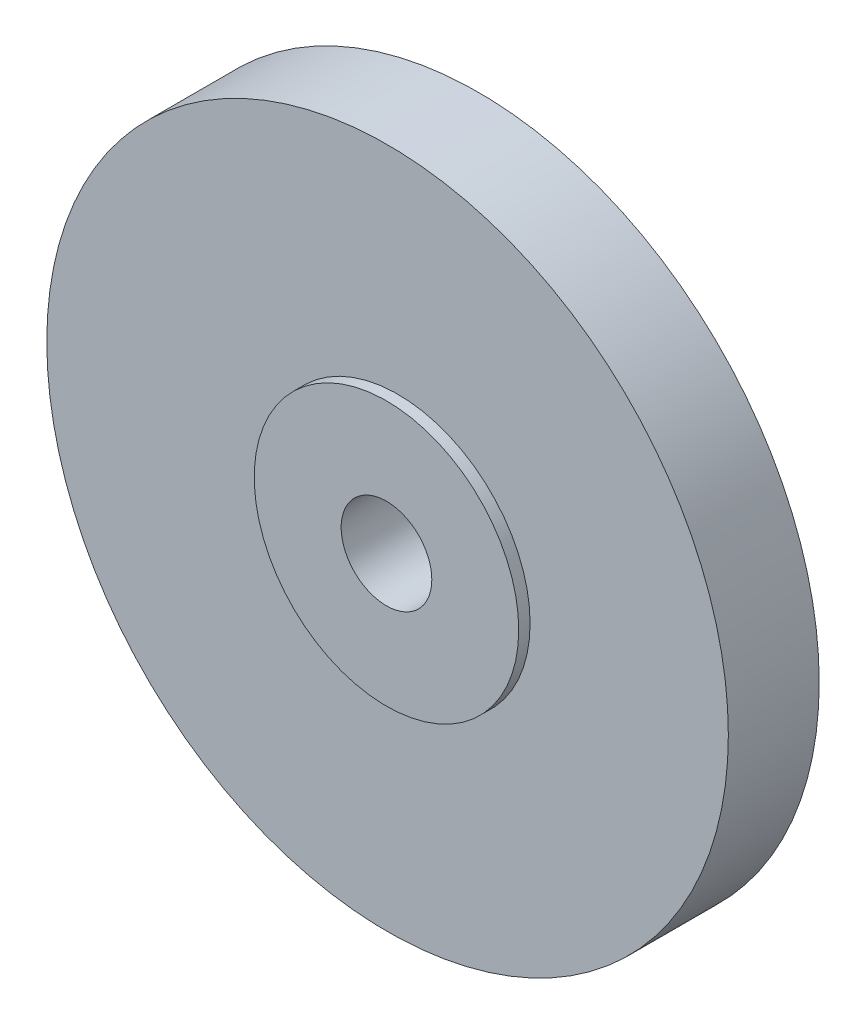
ISO-10303-21;
HEADER;
FILE_DESCRIPTION(('STEP AP214'),'2;1');
FILE_NAME('part.step','',(''),(''),'','','');
FILE_SCHEMA(('AUTOMOTIVE_DESIGN { 1 0 10303 214 1 1 1 1 }'));
ENDSEC;
DATA;
#1=APPLICATION_CONTEXT('core data for automotive mechanical design processes');
#2=APPLICATION_PROTOCOL_DEFINITION('international standard','automotive_design',2000,#1);
#3=PRODUCT_CONTEXT('',#1,'mechanical');
#4=PRODUCT('Part','Part','',(#3));
#5=PRODUCT_RELATED_PRODUCT_CATEGORY('part','',(#4));
#6=PRODUCT_DEFINITION_FORMATION('','',#4);
#7=PRODUCT_DEFINITION_CONTEXT('part definition',#1,'design');
#8=PRODUCT_DEFINITION('design','',#6,#7);
#9=PRODUCT_DEFINITION_SHAPE('','',#8);
#10=(LENGTH_UNIT() NAMED_UNIT(*) SI_UNIT(.MILLI.,.METRE.));
#11=(NAMED_UNIT(*) PLANE_ANGLE_UNIT() SI_UNIT($,.RADIAN.));
#12=(NAMED_UNIT(*) SI_UNIT($,.STERADIAN.) SOLID_ANGLE_UNIT());
#13=UNCERTAINTY_MEASURE_WITH_UNIT(LENGTH_MEASURE(1.E-05),#10,'distance_accuracy_value','');
#14=(GEOMETRIC_REPRESENTATION_CONTEXT(3) GLOBAL_UNCERTAINTY_ASSIGNED_CONTEXT((#13)) GLOBAL_UNIT_ASSIGNED_CONTEXT((#10,
#11,#12)) REPRESENTATION_CONTEXT('',''));
#15=CARTESIAN_POINT('',(0.,0.,0.));
#16=DIRECTION('',(0.,0.,1.));
#17=DIRECTION('',(1.,0.,0.));
#18=AXIS2_PLACEMENT_3D('',#15,#16,#17);
#19=CARTESIAN_POINT('',(-9.05017066074616,2.11952971182273,80.));
#20=DIRECTION('',(0.,0.,1.));
#21=DIRECTION('',(1.,0.,0.));
#22=AXIS2_PLACEMENT_3D('',#19,#20,#21);
#23=PLANE('',#22);
#24=CARTESIAN_POINT('',(-9.05017066074616,2.11952971182273,80.));
#25=DIRECTION('',(0.,0.,1.));
#26=DIRECTION('',(1.,0.,0.));
#27=AXIS2_PLACEMENT_3D('',#24,#25,#26);
#28=CIRCLE('',#27,300.);
#29=CARTESIAN_POINT('',(290.949829339254,2.11952971182273,80.));
#30=VERTEX_POINT('',#29);
#31=EDGE_CURVE('E10',#30,#30,#28,.T.);
#32=ORIENTED_EDGE('',*,*,#31,.T.);
#33=EDGE_LOOP('',(#32));
#34=FACE_BOUND('',#33,.T.);
#35=CARTESIAN_POINT('',(0.,0.,80.));
#36=DIRECTION('',(0.,0.,1.));
#37=DIRECTION('',(1.,0.,0.));
#38=AXIS2_PLACEMENT_3D('',#35,#36,#37);
#39=CIRCLE('',#38,116.427160802072);
#40=CARTESIAN_POINT('',(116.427160802072,0.,80.));
#41=VERTEX_POINT('',#40);
#42=EDGE_CURVE('E44',#41,#41,#39,.T.);
#43=ORIENTED_EDGE('',*,*,#42,.F.);
#44=EDGE_LOOP('',(#43));
#45=FACE_BOUND('',#44,.T.);
#46=ADVANCED_FACE('F31',(#34,#45),#23,.T.);
#47=CARTESIAN_POINT('',(-9.05017066074616,2.11952971182273,80.));
#48=DIRECTION('',(0.,0.,-1.));
#49=DIRECTION('',(-1.,0.,0.));
#50=AXIS2_PLACEMENT_3D('',#47,#48,#49);
#51=CYLINDRICAL_SURFACE('',#50,300.);
#52=ORIENTED_EDGE('',*,*,#31,.F.);
#53=EDGE_LOOP('',(#52));
#54=FACE_BOUND('',#53,.T.);
#55=CARTESIAN_POINT('',(-9.05017066074616,2.11952971182273,0.));
#56=DIRECTION('',(0.,0.,1.));
#57=DIRECTION('',(1.,0.,0.));
#58=AXIS2_PLACEMENT_3D('',#55,#56,#57);
#59=CIRCLE('',#58,300.);
#60=CARTESIAN_POINT('',(290.949829339254,2.11952971182273,0.));
#61=VERTEX_POINT('',#60);
#62=EDGE_CURVE('E35',#61,#61,#59,.T.);
#63=ORIENTED_EDGE('',*,*,#62,.T.);
#64=EDGE_LOOP('',(#63));
#65=FACE_BOUND('',#64,.T.);
#66=ADVANCED_FACE('F33',(#54,#65),#51,.T.);
#67=CARTESIAN_POINT('',(-9.05017066074616,2.11952971182273,0.));
#68=DIRECTION('',(0.,0.,1.));
#69=DIRECTION('',(1.,0.,0.));
#70=AXIS2_PLACEMENT_3D('',#67,#68,#69);
#71=PLANE('',#70);
#72=CARTESIAN_POINT('',(0.,0.,0.));
#73=DIRECTION('',(0.,0.,1.));
#74=DIRECTION('',(1.,0.,0.));
#75=AXIS2_PLACEMENT_3D('',#72,#73,#74);
#76=CIRCLE('',#75,39.900343406058);
#77=CARTESIAN_POINT('',(39.900343406058,0.,0.));
#78=VERTEX_POINT('',#77);
#79=EDGE_CURVE('E47',#78,#78,#76,.T.);
#80=ORIENTED_EDGE('',*,*,#79,.T.);
#81=EDGE_LOOP('',(#80));
#82=FACE_BOUND('',#81,.T.);
#83=ORIENTED_EDGE('',*,*,#62,.F.);
#84=EDGE_LOOP('',(#83));
#85=FACE_BOUND('',#84,.T.);
#86=ADVANCED_FACE('F56',(#82,#85),#71,.F.);
#87=CARTESIAN_POINT('',(0.,0.,90.));
#88=DIRECTION('',(0.,0.,-1.));
#89=DIRECTION('',(-1.,0.,0.));
#90=AXIS2_PLACEMENT_3D('',#87,#88,#89);
#91=CYLINDRICAL_SURFACE('',#90,116.427160802072);
#92=CARTESIAN_POINT('',(0.,0.,90.));
#93=DIRECTION('',(0.,0.,1.));
#94=DIRECTION('',(1.,0.,0.));
#95=AXIS2_PLACEMENT_3D('',#92,#93,#94);
#96=CIRCLE('',#95,116.427160802072);
#97=CARTESIAN_POINT('',(116.427160802072,0.,90.));
#98=VERTEX_POINT('',#97);
#99=EDGE_CURVE('E42',#98,#98,#96,.T.);
#100=ORIENTED_EDGE('',*,*,#99,.F.);
#101=EDGE_LOOP('',(#100));
#102=FACE_BOUND('',#101,.T.);
#103=ORIENTED_EDGE('',*,*,#42,.T.);
#104=EDGE_LOOP('',(#103));
#105=FACE_BOUND('',#104,.T.);
#106=ADVANCED_FACE('F68',(#102,#105),#91,.T.);
#107=CARTESIAN_POINT('',(0.,0.,90.));
#108=DIRECTION('',(0.,0.,1.));
#109=DIRECTION('',(1.,0.,0.));
#110=AXIS2_PLACEMENT_3D('',#107,#108,#109);
#111=PLANE('',#110);
#112=CARTESIAN_POINT('',(0.,0.,90.));
#113=DIRECTION('',(0.,0.,1.));
#114=DIRECTION('',(1.,0.,0.));
#115=AXIS2_PLACEMENT_3D('',#112,#113,#114);
#116=CIRCLE('',#115,39.900343406058);
#117=CARTESIAN_POINT('',(39.900343406058,0.,90.));
#118=VERTEX_POINT('',#117);
#119=EDGE_CURVE('E50',#118,#118,#116,.T.);
#120=ORIENTED_EDGE('',*,*,#119,.F.);
#121=EDGE_LOOP('',(#120));
#122=FACE_BOUND('',#121,.T.);
#123=ORIENTED_EDGE('',*,*,#99,.T.);
#124=EDGE_LOOP('',(#123));
#125=FACE_BOUND('',#124,.T.);
#126=ADVANCED_FACE('F62',(#122,#125),#111,.T.);
#127=CARTESIAN_POINT('',(0.,0.,0.));
#128=DIRECTION('',(0.,0.,1.));
#129=DIRECTION('',(1.,0.,0.));
#130=AXIS2_PLACEMENT_3D('',#127,#128,#129);
#131=CYLINDRICAL_SURFACE('',#130,39.900343406058);
#132=CARTESIAN_POINT('',(39.900343406058,0.,0.));
#133=CARTESIAN_POINT('',(39.900343406058,0.,0.937499999999998));
#134=CARTESIAN_POINT('',(39.900343406058,0.,1.875));
#135=CARTESIAN_POINT('',(39.900343406058,0.,3.75));
#136=CARTESIAN_POINT('',(39.900343406058,0.,4.6875));
#137=CARTESIAN_POINT('',(39.900343406058,0.,6.5625));
#138=CARTESIAN_POINT('',(39.900343406058,0.,7.5));
#139=CARTESIAN_POINT('',(39.900343406058,0.,9.375));
#140=CARTESIAN_POINT('',(39.900343406058,0.,10.3125));
#141=CARTESIAN_POINT('',(39.900343406058,0.,12.1875));
#142=CARTESIAN_POINT('',(39.900343406058,0.,13.125));
#143=CARTESIAN_POINT('',(39.900343406058,0.,15.));
#144=CARTESIAN_POINT('',(39.900343406058,0.,15.9375));
#145=CARTESIAN_POINT('',(39.900343406058,0.,17.8125));
#146=CARTESIAN_POINT('',(39.900343406058,0.,18.75));
#147=CARTESIAN_POINT('',(39.900343406058,0.,20.625));
#148=CARTESIAN_POINT('',(39.900343406058,0.,21.5625));
#149=CARTESIAN_POINT('',(39.900343406058,0.,23.4375));
#150=CARTESIAN_POINT('',(39.900343406058,0.,24.375));
#151=CARTESIAN_POINT('',(39.900343406058,0.,26.25));
#152=CARTESIAN_POINT('',(39.900343406058,0.,27.1875));
#153=CARTESIAN_POINT('',(39.900343406058,0.,29.0625));
#154=CARTESIAN_POINT('',(39.900343406058,0.,30.));
#155=CARTESIAN_POINT('',(39.900343406058,0.,31.875));
#156=CARTESIAN_POINT('',(39.900343406058,0.,32.8125));
#157=CARTESIAN_POINT('',(39.900343406058,0.,34.6875));
#158=CARTESIAN_POINT('',(39.900343406058,0.,35.625));
#159=CARTESIAN_POINT('',(39.900343406058,0.,37.5));
#160=CARTESIAN_POINT('',(39.900343406058,0.,38.4375));
#161=CARTESIAN_POINT('',(39.900343406058,0.,40.3125));
#162=CARTESIAN_POINT('',(39.900343406058,0.,41.25));
#163=CARTESIAN_POINT('',(39.900343406058,0.,43.125));
#164=CARTESIAN_POINT('',(39.900343406058,0.,44.0625));
#165=CARTESIAN_POINT('',(39.900343406058,0.,45.9375));
#166=CARTESIAN_POINT('',(39.900343406058,0.,46.875));
#167=CARTESIAN_POINT('',(39.900343406058,0.,48.75));
#168=CARTESIAN_POINT('',(39.900343406058,0.,49.6875));
#169=CARTESIAN_POINT('',(39.900343406058,0.,51.5625));
#170=CARTESIAN_POINT('',(39.900343406058,0.,52.5));
#171=CARTESIAN_POINT('',(39.900343406058,0.,54.375));
#172=CARTESIAN_POINT('',(39.900343406058,0.,55.3125));
#173=CARTESIAN_POINT('',(39.900343406058,0.,57.1875));
#174=CARTESIAN_POINT('',(39.900343406058,0.,58.125));
#175=CARTESIAN_POINT('',(39.900343406058,0.,60.));
#176=CARTESIAN_POINT('',(39.900343406058,0.,60.9375));
#177=CARTESIAN_POINT('',(39.900343406058,0.,62.8125));
#178=CARTESIAN_POINT('',(39.900343406058,0.,63.75));
#179=CARTESIAN_POINT('',(39.900343406058,0.,65.625));
#180=CARTESIAN_POINT('',(39.900343406058,0.,66.5625));
#181=CARTESIAN_POINT('',(39.900343406058,0.,68.4375));
#182=CARTESIAN_POINT('',(39.900343406058,0.,69.375));
#183=CARTESIAN_POINT('',(39.900343406058,0.,71.25));
#184=CARTESIAN_POINT('',(39.900343406058,0.,72.1875));
#185=CARTESIAN_POINT('',(39.900343406058,0.,74.0625));
#186=CARTESIAN_POINT('',(39.900343406058,0.,75.));
#187=CARTESIAN_POINT('',(39.900343406058,0.,76.875));
#188=CARTESIAN_POINT('',(39.900343406058,0.,77.8125));
#189=CARTESIAN_POINT('',(39.900343406058,0.,79.6875));
#190=CARTESIAN_POINT('',(39.900343406058,0.,80.625));
#191=CARTESIAN_POINT('',(39.900343406058,0.,82.5));
#192=CARTESIAN_POINT('',(39.900343406058,0.,83.4375));
#193=CARTESIAN_POINT('',(39.900343406058,0.,85.3125));
#194=CARTESIAN_POINT('',(39.900343406058,0.,86.25));
#195=CARTESIAN_POINT('',(39.900343406058,0.,88.125));
#196=CARTESIAN_POINT('',(39.900343406058,0.,89.0625));
#197=CARTESIAN_POINT('',(39.900343406058,0.,90.));
#198=B_SPLINE_CURVE_WITH_KNOTS('',3,(#132,#133,#134,#135,#136,#137,#138,#139,#140,#141,#142,
#143,#144,#145,#146,#147,#148,#149,#150,#151,#152,#153,#154,#155,#156,#157,#158,#159,#160,#161,
#162,#163,#164,#165,#166,#167,#168,#169,#170,#171,#172,#173,#174,#175,#176,#177,#178,#179,#180,
#181,#182,#183,#184,#185,#186,#187,#188,#189,#190,#191,#192,#193,#194,#195,#196,#197),
.UNSPECIFIED.,.F.,.F.,(4,2,2,2,2,2,2,2,2,2,2,2,2,2,2,2,2,2,2,2,2,2,2,2,2,2,2,2,2,2,2,2,4),(0.,
2.8125,5.625,8.4375,11.25,14.0625,16.875,19.6875,22.5,25.3125,28.125,30.9375,33.75,36.5625,
39.375,42.1875,45.,47.8125,50.625,53.4375,56.25,59.0625,61.875,64.6875,67.5,70.3125,73.125,
75.9375,78.75,81.5625,84.375,87.1875,90.),.UNSPECIFIED.);
#199=EDGE_CURVE('BSEAM59',#78,#118,#198,.T.);
#200=ORIENTED_EDGE('',*,*,#79,.F.);
#201=ORIENTED_EDGE('',*,*,#119,.T.);
#202=ORIENTED_EDGE('',*,*,#199,.T.);
#203=ORIENTED_EDGE('',*,*,#199,.F.);
#204=EDGE_LOOP('',(#200,#202,#201,#203));
#205=FACE_BOUND('',#204,.T.);
#206=ADVANCED_FACE('F59',(#205),#131,.F.);
#207=CLOSED_SHELL('',(#46,#66,#86,#106,#126,#206));
#208=MANIFOLD_SOLID_BREP('B2',#207);
#209=ADVANCED_BREP_SHAPE_REPRESENTATION('',(#18,#208),#14);
#210=SHAPE_DEFINITION_REPRESENTATION(#9,#209);
ENDSEC;
END-ISO-10303-21;
